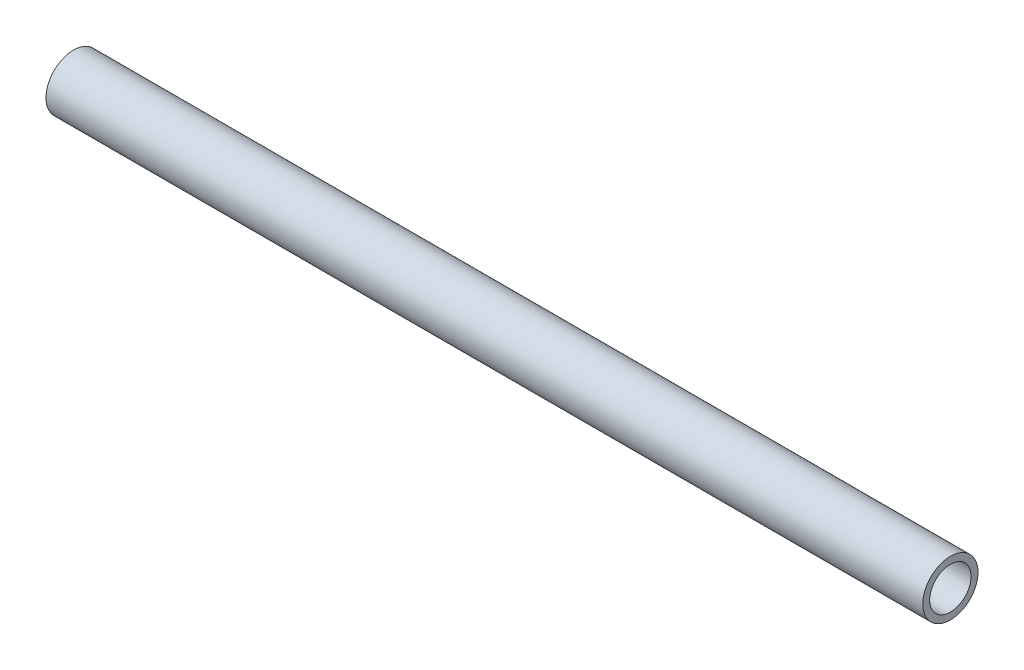
ISO-10303-21;
HEADER;
FILE_DESCRIPTION(('STEP AP214'),'2;1');
FILE_NAME('part.step','',(''),(''),'','','');
FILE_SCHEMA(('AUTOMOTIVE_DESIGN { 1 0 10303 214 1 1 1 1 }'));
ENDSEC;
DATA;
#1=APPLICATION_CONTEXT('core data for automotive mechanical design processes');
#2=APPLICATION_PROTOCOL_DEFINITION('international standard','automotive_design',2000,#1);
#3=PRODUCT_CONTEXT('',#1,'mechanical');
#4=PRODUCT('Part','Part','',(#3));
#5=PRODUCT_RELATED_PRODUCT_CATEGORY('part','',(#4));
#6=PRODUCT_DEFINITION_FORMATION('','',#4);
#7=PRODUCT_DEFINITION_CONTEXT('part definition',#1,'design');
#8=PRODUCT_DEFINITION('design','',#6,#7);
#9=PRODUCT_DEFINITION_SHAPE('','',#8);
#10=(LENGTH_UNIT() NAMED_UNIT(*) SI_UNIT(.MILLI.,.METRE.));
#11=(NAMED_UNIT(*) PLANE_ANGLE_UNIT() SI_UNIT($,.RADIAN.));
#12=(NAMED_UNIT(*) SI_UNIT($,.STERADIAN.) SOLID_ANGLE_UNIT());
#13=UNCERTAINTY_MEASURE_WITH_UNIT(LENGTH_MEASURE(1.E-05),#10,'distance_accuracy_value','');
#14=(GEOMETRIC_REPRESENTATION_CONTEXT(3) GLOBAL_UNCERTAINTY_ASSIGNED_CONTEXT((#13)) GLOBAL_UNIT_ASSIGNED_CONTEXT((#10,
#11,#12)) REPRESENTATION_CONTEXT('',''));
#15=CARTESIAN_POINT('',(0.,0.,0.));
#16=DIRECTION('',(0.,0.,1.));
#17=DIRECTION('',(1.,0.,0.));
#18=AXIS2_PLACEMENT_3D('',#15,#16,#17);
#19=CARTESIAN_POINT('',(0.,0.,0.));
#20=DIRECTION('',(1.,0.,0.));
#21=DIRECTION('',(0.,0.,-1.));
#22=AXIS2_PLACEMENT_3D('',#19,#20,#21);
#23=CYLINDRICAL_SURFACE('',#22,4.);
#24=CARTESIAN_POINT('',(127.,0.,0.));
#25=DIRECTION('',(1.,0.,0.));
#26=DIRECTION('',(0.,0.,-1.));
#27=AXIS2_PLACEMENT_3D('',#24,#25,#26);
#28=CIRCLE('',#27,4.);
#29=CARTESIAN_POINT('',(127.,0.,-4.));
#30=VERTEX_POINT('',#29);
#31=EDGE_CURVE('E42',#30,#30,#28,.T.);
#32=ORIENTED_EDGE('',*,*,#31,.F.);
#33=EDGE_LOOP('',(#32));
#34=FACE_BOUND('',#33,.T.);
#35=CARTESIAN_POINT('',(0.,0.,0.));
#36=DIRECTION('',(1.,0.,0.));
#37=DIRECTION('',(0.,0.,-1.));
#38=AXIS2_PLACEMENT_3D('',#35,#36,#37);
#39=CIRCLE('',#38,4.);
#40=CARTESIAN_POINT('',(0.,0.,-4.));
#41=VERTEX_POINT('',#40);
#42=EDGE_CURVE('E33',#41,#41,#39,.T.);
#43=ORIENTED_EDGE('',*,*,#42,.T.);
#44=EDGE_LOOP('',(#43));
#45=FACE_BOUND('',#44,.T.);
#46=ADVANCED_FACE('F30',(#34,#45),#23,.T.);
#47=CARTESIAN_POINT('',(0.,0.,0.));
#48=DIRECTION('',(1.,0.,0.));
#49=DIRECTION('',(0.,0.,-1.));
#50=AXIS2_PLACEMENT_3D('',#47,#48,#49);
#51=PLANE('',#50);
#52=CARTESIAN_POINT('',(0.,0.,0.));
#53=DIRECTION('',(1.,0.,0.));
#54=DIRECTION('',(0.,0.,-1.));
#55=AXIS2_PLACEMENT_3D('',#52,#53,#54);
#56=CIRCLE('',#55,3.);
#57=CARTESIAN_POINT('',(0.,0.,-3.));
#58=VERTEX_POINT('',#57);
#59=EDGE_CURVE('E37',#58,#58,#56,.F.);
#60=ORIENTED_EDGE('',*,*,#59,.F.);
#61=EDGE_LOOP('',(#60));
#62=FACE_BOUND('',#61,.T.);
#63=ORIENTED_EDGE('',*,*,#42,.F.);
#64=EDGE_LOOP('',(#63));
#65=FACE_BOUND('',#64,.T.);
#66=ADVANCED_FACE('F51',(#62,#65),#51,.F.);
#67=CARTESIAN_POINT('',(127.,0.,0.));
#68=DIRECTION('',(1.,0.,0.));
#69=DIRECTION('',(0.,0.,-1.));
#70=AXIS2_PLACEMENT_3D('',#67,#68,#69);
#71=PLANE('',#70);
#72=CARTESIAN_POINT('',(127.,0.,0.));
#73=DIRECTION('',(1.,0.,0.));
#74=DIRECTION('',(0.,0.,-1.));
#75=AXIS2_PLACEMENT_3D('',#72,#73,#74);
#76=CIRCLE('',#75,3.);
#77=CARTESIAN_POINT('',(127.,0.,-3.));
#78=VERTEX_POINT('',#77);
#79=EDGE_CURVE('E10',#78,#78,#76,.F.);
#80=ORIENTED_EDGE('',*,*,#79,.T.);
#81=EDGE_LOOP('',(#80));
#82=FACE_BOUND('',#81,.T.);
#83=ORIENTED_EDGE('',*,*,#31,.T.);
#84=EDGE_LOOP('',(#83));
#85=FACE_BOUND('',#84,.T.);
#86=ADVANCED_FACE('F53',(#82,#85),#71,.T.);
#87=CARTESIAN_POINT('',(0.,0.,0.));
#88=DIRECTION('',(1.,0.,0.));
#89=DIRECTION('',(0.,0.,-1.));
#90=AXIS2_PLACEMENT_3D('',#87,#88,#89);
#91=CYLINDRICAL_SURFACE('',#90,3.);
#92=ORIENTED_EDGE('',*,*,#79,.F.);
#93=EDGE_LOOP('',(#92));
#94=FACE_BOUND('',#93,.T.);
#95=ORIENTED_EDGE('',*,*,#59,.T.);
#96=EDGE_LOOP('',(#95));
#97=FACE_BOUND('',#96,.T.);
#98=ADVANCED_FACE('F59',(#94,#97),#91,.F.);
#99=CLOSED_SHELL('',(#46,#66,#86,#98));
#100=MANIFOLD_SOLID_BREP('B2',#99);
#101=ADVANCED_BREP_SHAPE_REPRESENTATION('',(#18,#100),#14);
#102=SHAPE_DEFINITION_REPRESENTATION(#9,#101);
ENDSEC;
END-ISO-10303-21;
